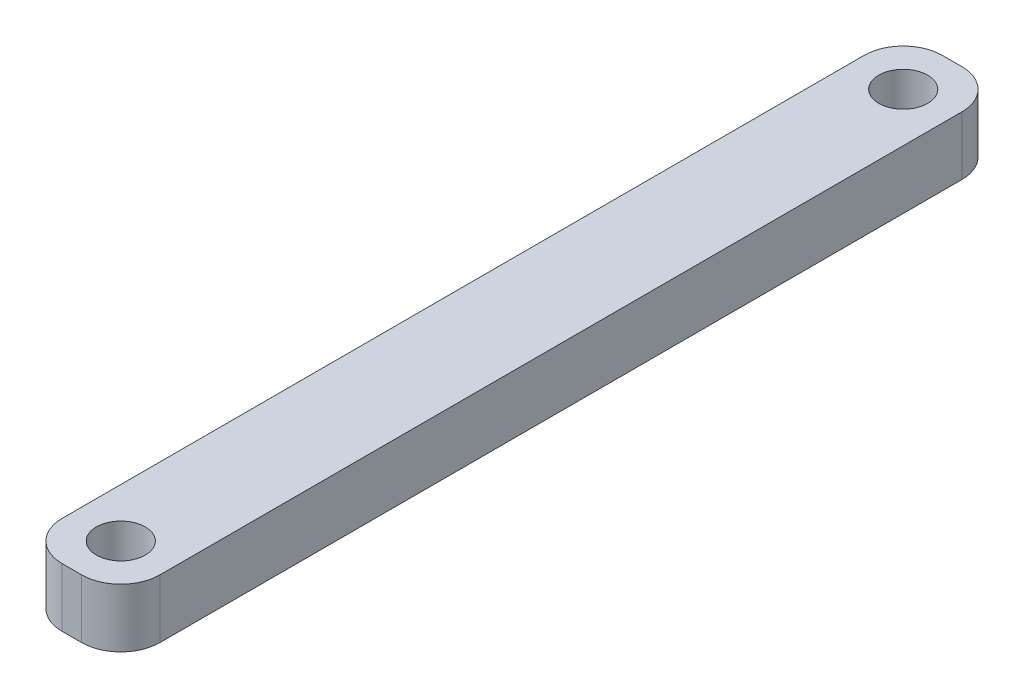
ISO-10303-21;
HEADER;
FILE_DESCRIPTION(('STEP AP214'),'2;1');
FILE_NAME('part.step','',(''),(''),'','','');
FILE_SCHEMA(('AUTOMOTIVE_DESIGN { 1 0 10303 214 1 1 1 1 }'));
ENDSEC;
DATA;
#1=APPLICATION_CONTEXT('core data for automotive mechanical design processes');
#2=APPLICATION_PROTOCOL_DEFINITION('international standard','automotive_design',2000,#1);
#3=PRODUCT_CONTEXT('',#1,'mechanical');
#4=PRODUCT('Part','Part','',(#3));
#5=PRODUCT_RELATED_PRODUCT_CATEGORY('part','',(#4));
#6=PRODUCT_DEFINITION_FORMATION('','',#4);
#7=PRODUCT_DEFINITION_CONTEXT('part definition',#1,'design');
#8=PRODUCT_DEFINITION('design','',#6,#7);
#9=PRODUCT_DEFINITION_SHAPE('','',#8);
#10=(LENGTH_UNIT() NAMED_UNIT(*) SI_UNIT(.MILLI.,.METRE.));
#11=(NAMED_UNIT(*) PLANE_ANGLE_UNIT() SI_UNIT($,.RADIAN.));
#12=(NAMED_UNIT(*) SI_UNIT($,.STERADIAN.) SOLID_ANGLE_UNIT());
#13=UNCERTAINTY_MEASURE_WITH_UNIT(LENGTH_MEASURE(1.E-05),#10,'distance_accuracy_value','');
#14=(GEOMETRIC_REPRESENTATION_CONTEXT(3) GLOBAL_UNCERTAINTY_ASSIGNED_CONTEXT((#13)) GLOBAL_UNIT_ASSIGNED_CONTEXT((#10,
#11,#12)) REPRESENTATION_CONTEXT('',''));
#15=CARTESIAN_POINT('',(0.,0.,0.));
#16=DIRECTION('',(0.,0.,1.));
#17=DIRECTION('',(1.,0.,0.));
#18=AXIS2_PLACEMENT_3D('',#15,#16,#17);
#19=CARTESIAN_POINT('',(0.,3.,0.));
#20=DIRECTION('',(0.,-1.,0.));
#21=DIRECTION('',(0.,0.,-1.));
#22=AXIS2_PLACEMENT_3D('',#19,#20,#21);
#23=PLANE('',#22);
#24=DIRECTION('',(0.,0.,1.));
#25=VECTOR('',#24,1.);
#26=CARTESIAN_POINT('',(-2.5,3.,22.5));
#27=LINE('',#26,#25);
#28=CARTESIAN_POINT('',(-2.5,3.,-20.5));
#29=VERTEX_POINT('',#28);
#30=CARTESIAN_POINT('',(-2.5,3.,20.5));
#31=VERTEX_POINT('',#30);
#32=EDGE_CURVE('E181',#29,#31,#27,.T.);
#33=ORIENTED_EDGE('',*,*,#32,.T.);
#34=CARTESIAN_POINT('',(-0.500000000000001,3.,20.5));
#35=DIRECTION('',(0.,-1.,0.));
#36=DIRECTION('',(0.,0.,-1.));
#37=AXIS2_PLACEMENT_3D('',#34,#35,#36);
#38=CIRCLE('',#37,2.);
#39=CARTESIAN_POINT('',(-0.500000000000001,3.,22.5));
#40=VERTEX_POINT('',#39);
#41=EDGE_CURVE('E169',#31,#40,#38,.F.);
#42=ORIENTED_EDGE('',*,*,#41,.T.);
#43=DIRECTION('',(1.,0.,0.));
#44=VECTOR('',#43,1.);
#45=CARTESIAN_POINT('',(-2.5,3.,22.5));
#46=LINE('',#45,#44);
#47=CARTESIAN_POINT('',(0.500000000000001,3.,22.5));
#48=VERTEX_POINT('',#47);
#49=EDGE_CURVE('E127',#40,#48,#46,.T.);
#50=ORIENTED_EDGE('',*,*,#49,.T.);
#51=CARTESIAN_POINT('',(0.500000000000001,3.,20.5));
#52=DIRECTION('',(0.,-1.,0.));
#53=DIRECTION('',(0.,0.,-1.));
#54=AXIS2_PLACEMENT_3D('',#51,#52,#53);
#55=CIRCLE('',#54,2.);
#56=CARTESIAN_POINT('',(2.5,3.,20.5));
#57=VERTEX_POINT('',#56);
#58=EDGE_CURVE('E166',#48,#57,#55,.F.);
#59=ORIENTED_EDGE('',*,*,#58,.T.);
#60=DIRECTION('',(0.,0.,-1.));
#61=VECTOR('',#60,1.);
#62=CARTESIAN_POINT('',(2.5,3.,22.5));
#63=LINE('',#62,#61);
#64=CARTESIAN_POINT('',(2.5,3.,-20.5));
#65=VERTEX_POINT('',#64);
#66=EDGE_CURVE('E136',#57,#65,#63,.T.);
#67=ORIENTED_EDGE('',*,*,#66,.T.);
#68=CARTESIAN_POINT('',(0.500000000000001,3.,-20.5));
#69=DIRECTION('',(0.,-1.,0.));
#70=DIRECTION('',(0.,0.,-1.));
#71=AXIS2_PLACEMENT_3D('',#68,#69,#70);
#72=CIRCLE('',#71,2.);
#73=CARTESIAN_POINT('',(0.500000000000001,3.,-22.5));
#74=VERTEX_POINT('',#73);
#75=EDGE_CURVE('E61',#65,#74,#72,.F.);
#76=ORIENTED_EDGE('',*,*,#75,.T.);
#77=DIRECTION('',(-1.,0.,0.));
#78=VECTOR('',#77,1.);
#79=CARTESIAN_POINT('',(-2.5,3.,-22.5));
#80=LINE('',#79,#78);
#81=CARTESIAN_POINT('',(-0.499999999999999,3.,-22.5));
#82=VERTEX_POINT('',#81);
#83=EDGE_CURVE('E141',#74,#82,#80,.T.);
#84=ORIENTED_EDGE('',*,*,#83,.T.);
#85=CARTESIAN_POINT('',(-0.499999999999999,3.,-20.5));
#86=DIRECTION('',(0.,-1.,0.));
#87=DIRECTION('',(0.,0.,-1.));
#88=AXIS2_PLACEMENT_3D('',#85,#86,#87);
#89=CIRCLE('',#88,2.);
#90=EDGE_CURVE('E161',#82,#29,#89,.F.);
#91=ORIENTED_EDGE('',*,*,#90,.T.);
#92=EDGE_LOOP('',(#33,#42,#50,#59,#67,#76,#84,#91));
#93=FACE_BOUND('',#92,.T.);
#94=CARTESIAN_POINT('',(0.,3.,-20.));
#95=DIRECTION('',(0.,1.,0.));
#96=DIRECTION('',(0.,0.,1.));
#97=AXIS2_PLACEMENT_3D('',#94,#95,#96);
#98=CIRCLE('',#97,1.25);
#99=CARTESIAN_POINT('',(0.,3.,-18.75));
#100=VERTEX_POINT('',#99);
#101=EDGE_CURVE('E193',#100,#100,#98,.T.);
#102=ORIENTED_EDGE('',*,*,#101,.F.);
#103=EDGE_LOOP('',(#102));
#104=FACE_BOUND('',#103,.T.);
#105=CARTESIAN_POINT('',(0.,3.,20.));
#106=DIRECTION('',(0.,1.,0.));
#107=DIRECTION('',(0.,0.,-1.));
#108=AXIS2_PLACEMENT_3D('',#105,#106,#107);
#109=CIRCLE('',#108,1.25);
#110=CARTESIAN_POINT('',(0.,3.,18.75));
#111=VERTEX_POINT('',#110);
#112=EDGE_CURVE('E236',#111,#111,#109,.T.);
#113=ORIENTED_EDGE('',*,*,#112,.F.);
#114=EDGE_LOOP('',(#113));
#115=FACE_BOUND('',#114,.T.);
#116=ADVANCED_FACE('F39',(#93,#104,#115),#23,.F.);
#117=CARTESIAN_POINT('',(0.,0.,0.));
#118=DIRECTION('',(0.,-1.,0.));
#119=DIRECTION('',(0.,0.,-1.));
#120=AXIS2_PLACEMENT_3D('',#117,#118,#119);
#121=PLANE('',#120);
#122=CARTESIAN_POINT('',(0.,0.,-20.));
#123=DIRECTION('',(0.,1.,0.));
#124=DIRECTION('',(0.,0.,1.));
#125=AXIS2_PLACEMENT_3D('',#122,#123,#124);
#126=CIRCLE('',#125,1.25);
#127=CARTESIAN_POINT('',(0.,0.,-18.75));
#128=VERTEX_POINT('',#127);
#129=EDGE_CURVE('E243',#128,#128,#126,.T.);
#130=ORIENTED_EDGE('',*,*,#129,.T.);
#131=EDGE_LOOP('',(#130));
#132=FACE_BOUND('',#131,.T.);
#133=DIRECTION('',(1.,0.,0.));
#134=VECTOR('',#133,1.);
#135=CARTESIAN_POINT('',(-2.5,0.,22.5));
#136=LINE('',#135,#134);
#137=CARTESIAN_POINT('',(-0.500000000000001,0.,22.5));
#138=VERTEX_POINT('',#137);
#139=CARTESIAN_POINT('',(0.500000000000001,0.,22.5));
#140=VERTEX_POINT('',#139);
#141=EDGE_CURVE('E124',#138,#140,#136,.T.);
#142=ORIENTED_EDGE('',*,*,#141,.F.);
#143=CARTESIAN_POINT('',(-0.500000000000001,0.,20.5));
#144=DIRECTION('',(0.,-1.,0.));
#145=DIRECTION('',(0.,0.,-1.));
#146=AXIS2_PLACEMENT_3D('',#143,#144,#145);
#147=CIRCLE('',#146,2.);
#148=CARTESIAN_POINT('',(-2.5,0.,20.5));
#149=VERTEX_POINT('',#148);
#150=EDGE_CURVE('E106',#138,#149,#147,.T.);
#151=ORIENTED_EDGE('',*,*,#150,.T.);
#152=DIRECTION('',(0.,0.,1.));
#153=VECTOR('',#152,1.);
#154=CARTESIAN_POINT('',(-2.5,0.,22.5));
#155=LINE('',#154,#153);
#156=CARTESIAN_POINT('',(-2.5,0.,-20.5));
#157=VERTEX_POINT('',#156);
#158=EDGE_CURVE('E137',#157,#149,#155,.T.);
#159=ORIENTED_EDGE('',*,*,#158,.F.);
#160=CARTESIAN_POINT('',(-0.499999999999999,0.,-20.5));
#161=DIRECTION('',(0.,-1.,0.));
#162=DIRECTION('',(0.,0.,-1.));
#163=AXIS2_PLACEMENT_3D('',#160,#161,#162);
#164=CIRCLE('',#163,2.);
#165=CARTESIAN_POINT('',(-0.499999999999999,0.,-22.5));
#166=VERTEX_POINT('',#165);
#167=EDGE_CURVE('E129',#157,#166,#164,.T.);
#168=ORIENTED_EDGE('',*,*,#167,.T.);
#169=DIRECTION('',(-1.,0.,0.));
#170=VECTOR('',#169,1.);
#171=CARTESIAN_POINT('',(-2.5,0.,-22.5));
#172=LINE('',#171,#170);
#173=CARTESIAN_POINT('',(0.500000000000001,0.,-22.5));
#174=VERTEX_POINT('',#173);
#175=EDGE_CURVE('E143',#174,#166,#172,.T.);
#176=ORIENTED_EDGE('',*,*,#175,.F.);
#177=CARTESIAN_POINT('',(0.500000000000001,0.,-20.5));
#178=DIRECTION('',(0.,-1.,0.));
#179=DIRECTION('',(0.,0.,-1.));
#180=AXIS2_PLACEMENT_3D('',#177,#178,#179);
#181=CIRCLE('',#180,2.);
#182=CARTESIAN_POINT('',(2.5,0.,-20.5));
#183=VERTEX_POINT('',#182);
#184=EDGE_CURVE('E151',#174,#183,#181,.T.);
#185=ORIENTED_EDGE('',*,*,#184,.T.);
#186=DIRECTION('',(0.,0.,-1.));
#187=VECTOR('',#186,1.);
#188=CARTESIAN_POINT('',(2.5,0.,22.5));
#189=LINE('',#188,#187);
#190=CARTESIAN_POINT('',(2.5,0.,20.5));
#191=VERTEX_POINT('',#190);
#192=EDGE_CURVE('E190',#191,#183,#189,.T.);
#193=ORIENTED_EDGE('',*,*,#192,.F.);
#194=CARTESIAN_POINT('',(0.500000000000001,0.,20.5));
#195=DIRECTION('',(0.,-1.,0.));
#196=DIRECTION('',(0.,0.,-1.));
#197=AXIS2_PLACEMENT_3D('',#194,#195,#196);
#198=CIRCLE('',#197,2.);
#199=EDGE_CURVE('E118',#191,#140,#198,.T.);
#200=ORIENTED_EDGE('',*,*,#199,.T.);
#201=EDGE_LOOP('',(#142,#151,#159,#168,#176,#185,#193,#200));
#202=FACE_BOUND('',#201,.T.);
#203=CARTESIAN_POINT('',(0.,0.,20.));
#204=DIRECTION('',(0.,1.,0.));
#205=DIRECTION('',(0.,0.,-1.));
#206=AXIS2_PLACEMENT_3D('',#203,#204,#205);
#207=CIRCLE('',#206,1.25);
#208=CARTESIAN_POINT('',(0.,0.,18.75));
#209=VERTEX_POINT('',#208);
#210=EDGE_CURVE('E239',#209,#209,#207,.T.);
#211=ORIENTED_EDGE('',*,*,#210,.T.);
#212=EDGE_LOOP('',(#211));
#213=FACE_BOUND('',#212,.T.);
#214=ADVANCED_FACE('F132',(#132,#202,#213),#121,.T.);
#215=CARTESIAN_POINT('',(2.5,3.,22.5));
#216=DIRECTION('',(-1.,0.,0.));
#217=DIRECTION('',(0.,0.,1.));
#218=AXIS2_PLACEMENT_3D('',#215,#216,#217);
#219=PLANE('',#218);
#220=ORIENTED_EDGE('',*,*,#66,.F.);
#221=DIRECTION('',(0.,-1.,0.));
#222=VECTOR('',#221,1.);
#223=CARTESIAN_POINT('',(2.5,3.,20.5));
#224=LINE('',#223,#222);
#225=EDGE_CURVE('E175',#57,#191,#224,.T.);
#226=ORIENTED_EDGE('',*,*,#225,.T.);
#227=ORIENTED_EDGE('',*,*,#192,.T.);
#228=DIRECTION('',(0.,-1.,0.));
#229=VECTOR('',#228,1.);
#230=CARTESIAN_POINT('',(2.5,3.,-20.5));
#231=LINE('',#230,#229);
#232=EDGE_CURVE('E172',#183,#65,#231,.F.);
#233=ORIENTED_EDGE('',*,*,#232,.T.);
#234=EDGE_LOOP('',(#220,#226,#227,#233));
#235=FACE_BOUND('',#234,.T.);
#236=ADVANCED_FACE('F212',(#235),#219,.F.);
#237=CARTESIAN_POINT('',(-2.5,3.,-22.5));
#238=DIRECTION('',(0.,0.,1.));
#239=DIRECTION('',(1.,0.,0.));
#240=AXIS2_PLACEMENT_3D('',#237,#238,#239);
#241=PLANE('',#240);
#242=ORIENTED_EDGE('',*,*,#83,.F.);
#243=DIRECTION('',(0.,-1.,0.));
#244=VECTOR('',#243,1.);
#245=CARTESIAN_POINT('',(0.500000000000001,3.,-22.5));
#246=LINE('',#245,#244);
#247=EDGE_CURVE('E11',#74,#174,#246,.T.);
#248=ORIENTED_EDGE('',*,*,#247,.T.);
#249=ORIENTED_EDGE('',*,*,#175,.T.);
#250=DIRECTION('',(0.,-1.,0.));
#251=VECTOR('',#250,1.);
#252=CARTESIAN_POINT('',(-0.499999999999999,3.,-22.5));
#253=LINE('',#252,#251);
#254=EDGE_CURVE('E48',#166,#82,#253,.F.);
#255=ORIENTED_EDGE('',*,*,#254,.T.);
#256=EDGE_LOOP('',(#242,#248,#249,#255));
#257=FACE_BOUND('',#256,.T.);
#258=ADVANCED_FACE('F196',(#257),#241,.F.);
#259=CARTESIAN_POINT('',(-2.5,3.,22.5));
#260=DIRECTION('',(1.,0.,0.));
#261=DIRECTION('',(0.,0.,-1.));
#262=AXIS2_PLACEMENT_3D('',#259,#260,#261);
#263=PLANE('',#262);
#264=ORIENTED_EDGE('',*,*,#158,.T.);
#265=DIRECTION('',(0.,-1.,0.));
#266=VECTOR('',#265,1.);
#267=CARTESIAN_POINT('',(-2.5,3.,20.5));
#268=LINE('',#267,#266);
#269=EDGE_CURVE('E111',#149,#31,#268,.F.);
#270=ORIENTED_EDGE('',*,*,#269,.T.);
#271=ORIENTED_EDGE('',*,*,#32,.F.);
#272=DIRECTION('',(0.,-1.,0.));
#273=VECTOR('',#272,1.);
#274=CARTESIAN_POINT('',(-2.5,3.,-20.5));
#275=LINE('',#274,#273);
#276=EDGE_CURVE('E117',#29,#157,#275,.T.);
#277=ORIENTED_EDGE('',*,*,#276,.T.);
#278=EDGE_LOOP('',(#264,#270,#271,#277));
#279=FACE_BOUND('',#278,.T.);
#280=ADVANCED_FACE('F203',(#279),#263,.F.);
#281=CARTESIAN_POINT('',(-2.5,3.,22.5));
#282=DIRECTION('',(0.,0.,-1.));
#283=DIRECTION('',(-1.,0.,0.));
#284=AXIS2_PLACEMENT_3D('',#281,#282,#283);
#285=PLANE('',#284);
#286=ORIENTED_EDGE('',*,*,#49,.F.);
#287=DIRECTION('',(0.,-1.,0.));
#288=VECTOR('',#287,1.);
#289=CARTESIAN_POINT('',(-0.500000000000001,3.,22.5));
#290=LINE('',#289,#288);
#291=EDGE_CURVE('E110',#40,#138,#290,.T.);
#292=ORIENTED_EDGE('',*,*,#291,.T.);
#293=ORIENTED_EDGE('',*,*,#141,.T.);
#294=DIRECTION('',(0.,-1.,0.));
#295=VECTOR('',#294,1.);
#296=CARTESIAN_POINT('',(0.500000000000001,3.,22.5));
#297=LINE('',#296,#295);
#298=EDGE_CURVE('E130',#140,#48,#297,.F.);
#299=ORIENTED_EDGE('',*,*,#298,.T.);
#300=EDGE_LOOP('',(#286,#292,#293,#299));
#301=FACE_BOUND('',#300,.T.);
#302=ADVANCED_FACE('F123',(#301),#285,.F.);
#303=CARTESIAN_POINT('',(0.,3.,-20.));
#304=DIRECTION('',(0.,-1.,0.));
#305=DIRECTION('',(0.,0.,-1.));
#306=AXIS2_PLACEMENT_3D('',#303,#304,#305);
#307=CYLINDRICAL_SURFACE('',#306,1.25);
#308=ORIENTED_EDGE('',*,*,#101,.T.);
#309=EDGE_LOOP('',(#308));
#310=FACE_BOUND('',#309,.T.);
#311=ORIENTED_EDGE('',*,*,#129,.F.);
#312=EDGE_LOOP('',(#311));
#313=FACE_BOUND('',#312,.T.);
#314=ADVANCED_FACE('F210',(#310,#313),#307,.F.);
#315=CARTESIAN_POINT('',(0.,3.,20.));
#316=DIRECTION('',(0.,-1.,0.));
#317=DIRECTION('',(0.,0.,-1.));
#318=AXIS2_PLACEMENT_3D('',#315,#316,#317);
#319=CYLINDRICAL_SURFACE('',#318,1.25);
#320=ORIENTED_EDGE('',*,*,#112,.T.);
#321=EDGE_LOOP('',(#320));
#322=FACE_BOUND('',#321,.T.);
#323=ORIENTED_EDGE('',*,*,#210,.F.);
#324=EDGE_LOOP('',(#323));
#325=FACE_BOUND('',#324,.T.);
#326=ADVANCED_FACE('F224',(#322,#325),#319,.F.);
#327=CARTESIAN_POINT('',(-0.500000000000001,3.,20.5));
#328=DIRECTION('',(0.,-1.,0.));
#329=DIRECTION('',(0.,0.,-1.));
#330=AXIS2_PLACEMENT_3D('',#327,#328,#329);
#331=CYLINDRICAL_SURFACE('',#330,2.);
#332=ORIENTED_EDGE('',*,*,#41,.F.);
#333=ORIENTED_EDGE('',*,*,#269,.F.);
#334=ORIENTED_EDGE('',*,*,#150,.F.);
#335=ORIENTED_EDGE('',*,*,#291,.F.);
#336=EDGE_LOOP('',(#332,#333,#334,#335));
#337=FACE_BOUND('',#336,.T.);
#338=ADVANCED_FACE('F109',(#337),#331,.T.);
#339=CARTESIAN_POINT('',(0.500000000000001,3.,20.5));
#340=DIRECTION('',(0.,-1.,0.));
#341=DIRECTION('',(0.,0.,-1.));
#342=AXIS2_PLACEMENT_3D('',#339,#340,#341);
#343=CYLINDRICAL_SURFACE('',#342,2.);
#344=ORIENTED_EDGE('',*,*,#58,.F.);
#345=ORIENTED_EDGE('',*,*,#298,.F.);
#346=ORIENTED_EDGE('',*,*,#199,.F.);
#347=ORIENTED_EDGE('',*,*,#225,.F.);
#348=EDGE_LOOP('',(#344,#345,#346,#347));
#349=FACE_BOUND('',#348,.T.);
#350=ADVANCED_FACE('F231',(#349),#343,.T.);
#351=CARTESIAN_POINT('',(0.500000000000001,3.,-20.5));
#352=DIRECTION('',(0.,-1.,0.));
#353=DIRECTION('',(0.,0.,-1.));
#354=AXIS2_PLACEMENT_3D('',#351,#352,#353);
#355=CYLINDRICAL_SURFACE('',#354,2.);
#356=ORIENTED_EDGE('',*,*,#75,.F.);
#357=ORIENTED_EDGE('',*,*,#232,.F.);
#358=ORIENTED_EDGE('',*,*,#184,.F.);
#359=ORIENTED_EDGE('',*,*,#247,.F.);
#360=EDGE_LOOP('',(#356,#357,#358,#359));
#361=FACE_BOUND('',#360,.T.);
#362=ADVANCED_FACE('F257',(#361),#355,.T.);
#363=CARTESIAN_POINT('',(-0.499999999999999,3.,-20.5));
#364=DIRECTION('',(0.,-1.,0.));
#365=DIRECTION('',(0.,0.,-1.));
#366=AXIS2_PLACEMENT_3D('',#363,#364,#365);
#367=CYLINDRICAL_SURFACE('',#366,2.);
#368=ORIENTED_EDGE('',*,*,#90,.F.);
#369=ORIENTED_EDGE('',*,*,#254,.F.);
#370=ORIENTED_EDGE('',*,*,#167,.F.);
#371=ORIENTED_EDGE('',*,*,#276,.F.);
#372=EDGE_LOOP('',(#368,#369,#370,#371));
#373=FACE_BOUND('',#372,.T.);
#374=ADVANCED_FACE('F41',(#373),#367,.T.);
#375=CLOSED_SHELL('',(#116,#214,#236,#258,#280,#302,#314,#326,#338,#350,#362,#374));
#376=MANIFOLD_SOLID_BREP('B2',#375);
#377=ADVANCED_BREP_SHAPE_REPRESENTATION('',(#18,#376),#14);
#378=SHAPE_DEFINITION_REPRESENTATION(#9,#377);
ENDSEC;
END-ISO-10303-21;
